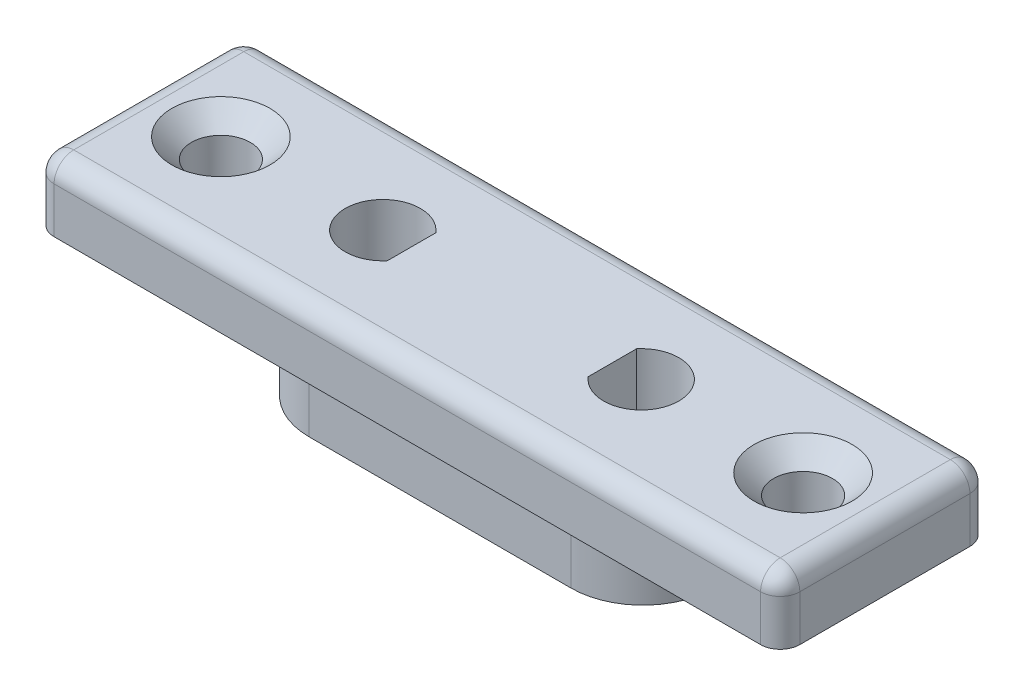
ISO-10303-21;
HEADER;
FILE_DESCRIPTION(('STEP AP214'),'2;1');
FILE_NAME('part.step','',(''),(''),'','','');
FILE_SCHEMA(('AUTOMOTIVE_DESIGN { 1 0 10303 214 1 1 1 1 }'));
ENDSEC;
DATA;
#1=APPLICATION_CONTEXT('core data for automotive mechanical design processes');
#2=APPLICATION_PROTOCOL_DEFINITION('international standard','automotive_design',2000,#1);
#3=PRODUCT_CONTEXT('',#1,'mechanical');
#4=PRODUCT('Part','Part','',(#3));
#5=PRODUCT_RELATED_PRODUCT_CATEGORY('part','',(#4));
#6=PRODUCT_DEFINITION_FORMATION('','',#4);
#7=PRODUCT_DEFINITION_CONTEXT('part definition',#1,'design');
#8=PRODUCT_DEFINITION('design','',#6,#7);
#9=PRODUCT_DEFINITION_SHAPE('','',#8);
#10=(LENGTH_UNIT() NAMED_UNIT(*) SI_UNIT(.MILLI.,.METRE.));
#11=(NAMED_UNIT(*) PLANE_ANGLE_UNIT() SI_UNIT($,.RADIAN.));
#12=(NAMED_UNIT(*) SI_UNIT($,.STERADIAN.) SOLID_ANGLE_UNIT());
#13=UNCERTAINTY_MEASURE_WITH_UNIT(LENGTH_MEASURE(1.E-05),#10,'distance_accuracy_value','');
#14=(GEOMETRIC_REPRESENTATION_CONTEXT(3) GLOBAL_UNCERTAINTY_ASSIGNED_CONTEXT((#13)) GLOBAL_UNIT_ASSIGNED_CONTEXT((#10,
#11,#12)) REPRESENTATION_CONTEXT('',''));
#15=CARTESIAN_POINT('',(0.,0.,0.));
#16=DIRECTION('',(0.,0.,1.));
#17=DIRECTION('',(1.,0.,0.));
#18=AXIS2_PLACEMENT_3D('',#15,#16,#17);
#19=CARTESIAN_POINT('',(18.5,-6.,-8.));
#20=DIRECTION('',(0.,-1.,0.));
#21=DIRECTION('',(0.,0.,-1.));
#22=AXIS2_PLACEMENT_3D('',#19,#20,#21);
#23=PLANE('',#22);
#24=DIRECTION('',(0.,0.,1.));
#25=VECTOR('',#24,1.);
#26=CARTESIAN_POINT('',(20.825,-6.,-9.85084440188795));
#27=LINE('',#26,#25);
#28=CARTESIAN_POINT('',(20.825,-6.,-9.85084440188795));
#29=VERTEX_POINT('',#28);
#30=CARTESIAN_POINT('',(20.825,-6.,-6.14915559811204));
#31=VERTEX_POINT('',#30);
#32=EDGE_CURVE('E174',#29,#31,#27,.T.);
#33=ORIENTED_EDGE('',*,*,#32,.F.);
#34=CARTESIAN_POINT('',(18.625,-6.,-8.));
#35=DIRECTION('',(0.,-1.,0.));
#36=DIRECTION('',(0.,0.,-1.));
#37=AXIS2_PLACEMENT_3D('',#34,#35,#36);
#38=CIRCLE('',#37,2.875);
#39=EDGE_CURVE('E164',#31,#29,#38,.T.);
#40=ORIENTED_EDGE('',*,*,#39,.F.);
#41=EDGE_LOOP('',(#33,#40));
#42=FACE_BOUND('',#41,.T.);
#43=DIRECTION('',(0.,0.,-1.));
#44=VECTOR('',#43,1.);
#45=CARTESIAN_POINT('',(36.175,-6.,-6.14915559811205));
#46=LINE('',#45,#44);
#47=CARTESIAN_POINT('',(36.175,-6.,-6.14915559811205));
#48=VERTEX_POINT('',#47);
#49=CARTESIAN_POINT('',(36.175,-6.,-9.85084440188795));
#50=VERTEX_POINT('',#49);
#51=EDGE_CURVE('E189',#48,#50,#46,.T.);
#52=ORIENTED_EDGE('',*,*,#51,.F.);
#53=CARTESIAN_POINT('',(38.375,-6.,-8.));
#54=DIRECTION('',(0.,-1.,0.));
#55=DIRECTION('',(0.,0.,-1.));
#56=AXIS2_PLACEMENT_3D('',#53,#54,#55);
#57=CIRCLE('',#56,2.875);
#58=EDGE_CURVE('E177',#50,#48,#57,.T.);
#59=ORIENTED_EDGE('',*,*,#58,.F.);
#60=EDGE_LOOP('',(#52,#59));
#61=FACE_BOUND('',#60,.T.);
#62=CARTESIAN_POINT('',(18.5,-6.,-8.));
#63=DIRECTION('',(0.,-1.,0.));
#64=DIRECTION('',(0.,0.,-1.));
#65=AXIS2_PLACEMENT_3D('',#62,#63,#64);
#66=CIRCLE('',#65,5.5);
#67=CARTESIAN_POINT('',(18.5,-6.,-2.5));
#68=VERTEX_POINT('',#67);
#69=CARTESIAN_POINT('',(18.5,-6.,-13.5));
#70=VERTEX_POINT('',#69);
#71=EDGE_CURVE('E193',#68,#70,#66,.T.);
#72=ORIENTED_EDGE('',*,*,#71,.T.);
#73=DIRECTION('',(1.,0.,0.));
#74=VECTOR('',#73,1.);
#75=CARTESIAN_POINT('',(18.5,-6.,-13.5));
#76=LINE('',#75,#74);
#77=CARTESIAN_POINT('',(38.5,-6.,-13.5));
#78=VERTEX_POINT('',#77);
#79=EDGE_CURVE('E196',#70,#78,#76,.T.);
#80=ORIENTED_EDGE('',*,*,#79,.T.);
#81=CARTESIAN_POINT('',(38.5,-6.,-8.));
#82=DIRECTION('',(0.,-1.,0.));
#83=DIRECTION('',(0.,0.,-1.));
#84=AXIS2_PLACEMENT_3D('',#81,#82,#83);
#85=CIRCLE('',#84,5.5);
#86=CARTESIAN_POINT('',(38.5,-6.,-2.5));
#87=VERTEX_POINT('',#86);
#88=EDGE_CURVE('E199',#78,#87,#85,.T.);
#89=ORIENTED_EDGE('',*,*,#88,.T.);
#90=DIRECTION('',(-1.,0.,0.));
#91=VECTOR('',#90,1.);
#92=CARTESIAN_POINT('',(38.5,-6.,-2.5));
#93=LINE('',#92,#91);
#94=EDGE_CURVE('E201',#87,#68,#93,.T.);
#95=ORIENTED_EDGE('',*,*,#94,.T.);
#96=EDGE_LOOP('',(#72,#80,#89,#95));
#97=FACE_BOUND('',#96,.T.);
#98=CARTESIAN_POINT('',(28.5,-6.,-8.));
#99=DIRECTION('',(0.,-1.,0.));
#100=DIRECTION('',(0.,0.,-1.));
#101=AXIS2_PLACEMENT_3D('',#98,#99,#100);
#102=CIRCLE('',#101,4.);
#103=CARTESIAN_POINT('',(28.5,-6.,-12.));
#104=VERTEX_POINT('',#103);
#105=EDGE_CURVE('E407',#104,#104,#102,.T.);
#106=ORIENTED_EDGE('',*,*,#105,.F.);
#107=EDGE_LOOP('',(#106));
#108=FACE_BOUND('',#107,.T.);
#109=ADVANCED_FACE('F34',(#42,#61,#97,#108),#23,.T.);
#110=CARTESIAN_POINT('',(0.,0.,0.));
#111=DIRECTION('',(0.,-1.,0.));
#112=DIRECTION('',(0.,0.,-1.));
#113=AXIS2_PLACEMENT_3D('',#110,#111,#112);
#114=PLANE('',#113);
#115=DIRECTION('',(1.,0.,0.));
#116=VECTOR('',#115,1.);
#117=CARTESIAN_POINT('',(57.,0.,0.));
#118=LINE('',#117,#116);
#119=CARTESIAN_POINT('',(1.50000000000002,0.,0.));
#120=VERTEX_POINT('',#119);
#121=CARTESIAN_POINT('',(55.5,0.,0.));
#122=VERTEX_POINT('',#121);
#123=EDGE_CURVE('E237',#120,#122,#118,.T.);
#124=ORIENTED_EDGE('',*,*,#123,.F.);
#125=CARTESIAN_POINT('',(1.5,0.,-1.5));
#126=DIRECTION('',(0.,-1.,0.));
#127=DIRECTION('',(0.,0.,-1.));
#128=AXIS2_PLACEMENT_3D('',#125,#126,#127);
#129=CIRCLE('',#128,1.5);
#130=CARTESIAN_POINT('',(0.,0.,-1.5));
#131=VERTEX_POINT('',#130);
#132=EDGE_CURVE('E290',#120,#131,#129,.T.);
#133=ORIENTED_EDGE('',*,*,#132,.T.);
#134=DIRECTION('',(0.,0.,1.));
#135=VECTOR('',#134,1.);
#136=CARTESIAN_POINT('',(0.,0.,0.));
#137=LINE('',#136,#135);
#138=CARTESIAN_POINT('',(0.,0.,-14.5));
#139=VERTEX_POINT('',#138);
#140=EDGE_CURVE('E247',#139,#131,#137,.T.);
#141=ORIENTED_EDGE('',*,*,#140,.F.);
#142=CARTESIAN_POINT('',(1.5,0.,-14.5));
#143=DIRECTION('',(0.,-1.,0.));
#144=DIRECTION('',(0.,0.,-1.));
#145=AXIS2_PLACEMENT_3D('',#142,#143,#144);
#146=CIRCLE('',#145,1.5);
#147=CARTESIAN_POINT('',(1.5,0.,-16.));
#148=VERTEX_POINT('',#147);
#149=EDGE_CURVE('E288',#139,#148,#146,.T.);
#150=ORIENTED_EDGE('',*,*,#149,.T.);
#151=DIRECTION('',(-1.,0.,0.));
#152=VECTOR('',#151,1.);
#153=CARTESIAN_POINT('',(0.,0.,-16.));
#154=LINE('',#153,#152);
#155=CARTESIAN_POINT('',(55.5,0.,-16.));
#156=VERTEX_POINT('',#155);
#157=EDGE_CURVE('E244',#156,#148,#154,.T.);
#158=ORIENTED_EDGE('',*,*,#157,.F.);
#159=CARTESIAN_POINT('',(55.5,0.,-14.5));
#160=DIRECTION('',(0.,-1.,0.));
#161=DIRECTION('',(0.,0.,-1.));
#162=AXIS2_PLACEMENT_3D('',#159,#160,#161);
#163=CIRCLE('',#162,1.5);
#164=CARTESIAN_POINT('',(57.,0.,-14.5));
#165=VERTEX_POINT('',#164);
#166=EDGE_CURVE('E286',#156,#165,#163,.T.);
#167=ORIENTED_EDGE('',*,*,#166,.T.);
#168=DIRECTION('',(0.,0.,-1.));
#169=VECTOR('',#168,1.);
#170=CARTESIAN_POINT('',(57.,0.,-16.));
#171=LINE('',#170,#169);
#172=CARTESIAN_POINT('',(57.,0.,-1.5));
#173=VERTEX_POINT('',#172);
#174=EDGE_CURVE('E240',#173,#165,#171,.T.);
#175=ORIENTED_EDGE('',*,*,#174,.F.);
#176=CARTESIAN_POINT('',(55.5,0.,-1.5));
#177=DIRECTION('',(0.,-1.,0.));
#178=DIRECTION('',(0.,0.,-1.));
#179=AXIS2_PLACEMENT_3D('',#176,#177,#178);
#180=CIRCLE('',#179,1.5);
#181=EDGE_CURVE('E284',#173,#122,#180,.T.);
#182=ORIENTED_EDGE('',*,*,#181,.T.);
#183=EDGE_LOOP('',(#124,#133,#141,#150,#158,#167,#175,#182));
#184=FACE_BOUND('',#183,.T.);
#185=CARTESIAN_POINT('',(50.75,0.,-8.00000000000001));
#186=DIRECTION('',(0.,1.,0.));
#187=DIRECTION('',(0.,0.,1.));
#188=AXIS2_PLACEMENT_3D('',#185,#186,#187);
#189=CIRCLE('',#188,2.25);
#190=CARTESIAN_POINT('',(50.75,0.,-5.75000000000001));
#191=VERTEX_POINT('',#190);
#192=EDGE_CURVE('E222',#191,#191,#189,.T.);
#193=ORIENTED_EDGE('',*,*,#192,.T.);
#194=EDGE_LOOP('',(#193));
#195=FACE_BOUND('',#194,.T.);
#196=CARTESIAN_POINT('',(6.25,0.,-8.));
#197=DIRECTION('',(0.,1.,0.));
#198=DIRECTION('',(0.,0.,1.));
#199=AXIS2_PLACEMENT_3D('',#196,#197,#198);
#200=CIRCLE('',#199,2.25);
#201=CARTESIAN_POINT('',(6.25,0.,-5.75));
#202=VERTEX_POINT('',#201);
#203=EDGE_CURVE('E219',#202,#202,#200,.T.);
#204=ORIENTED_EDGE('',*,*,#203,.T.);
#205=EDGE_LOOP('',(#204));
#206=FACE_BOUND('',#205,.T.);
#207=DIRECTION('',(1.,0.,0.));
#208=VECTOR('',#207,1.);
#209=CARTESIAN_POINT('',(18.5,0.,-13.5));
#210=LINE('',#209,#208);
#211=CARTESIAN_POINT('',(18.5,0.,-13.5));
#212=VERTEX_POINT('',#211);
#213=CARTESIAN_POINT('',(38.5,0.,-13.5));
#214=VERTEX_POINT('',#213);
#215=EDGE_CURVE('E206',#212,#214,#210,.T.);
#216=ORIENTED_EDGE('',*,*,#215,.F.);
#217=CARTESIAN_POINT('',(18.5,0.,-8.));
#218=DIRECTION('',(0.,-1.,0.));
#219=DIRECTION('',(0.,0.,-1.));
#220=AXIS2_PLACEMENT_3D('',#217,#218,#219);
#221=CIRCLE('',#220,5.5);
#222=CARTESIAN_POINT('',(18.5,0.,-2.5));
#223=VERTEX_POINT('',#222);
#224=EDGE_CURVE('E192',#223,#212,#221,.T.);
#225=ORIENTED_EDGE('',*,*,#224,.F.);
#226=DIRECTION('',(-1.,0.,0.));
#227=VECTOR('',#226,1.);
#228=CARTESIAN_POINT('',(38.5,0.,-2.5));
#229=LINE('',#228,#227);
#230=CARTESIAN_POINT('',(38.5,0.,-2.5));
#231=VERTEX_POINT('',#230);
#232=EDGE_CURVE('E197',#231,#223,#229,.T.);
#233=ORIENTED_EDGE('',*,*,#232,.F.);
#234=CARTESIAN_POINT('',(38.5,0.,-8.));
#235=DIRECTION('',(0.,-1.,0.));
#236=DIRECTION('',(0.,0.,-1.));
#237=AXIS2_PLACEMENT_3D('',#234,#235,#236);
#238=CIRCLE('',#237,5.5);
#239=EDGE_CURVE('E208',#214,#231,#238,.T.);
#240=ORIENTED_EDGE('',*,*,#239,.F.);
#241=EDGE_LOOP('',(#216,#225,#233,#240));
#242=FACE_BOUND('',#241,.T.);
#243=ADVANCED_FACE('F348',(#184,#195,#206,#242),#114,.T.);
#244=CARTESIAN_POINT('',(57.,5.,0.));
#245=DIRECTION('',(0.,0.,-1.));
#246=DIRECTION('',(-1.,0.,0.));
#247=AXIS2_PLACEMENT_3D('',#244,#245,#246);
#248=PLANE('',#247);
#249=DIRECTION('',(1.,0.,0.));
#250=VECTOR('',#249,1.);
#251=CARTESIAN_POINT('',(57.,3.5,0.));
#252=LINE('',#251,#250);
#253=CARTESIAN_POINT('',(55.5,3.5,0.));
#254=VERTEX_POINT('',#253);
#255=CARTESIAN_POINT('',(1.5,3.5,0.));
#256=VERTEX_POINT('',#255);
#257=EDGE_CURVE('E280',#254,#256,#252,.F.);
#258=ORIENTED_EDGE('',*,*,#257,.T.);
#259=DIRECTION('',(0.,-1.,0.));
#260=VECTOR('',#259,1.);
#261=CARTESIAN_POINT('',(1.5,5.,0.));
#262=LINE('',#261,#260);
#263=EDGE_CURVE('E282',#256,#120,#262,.T.);
#264=ORIENTED_EDGE('',*,*,#263,.T.);
#265=ORIENTED_EDGE('',*,*,#123,.T.);
#266=DIRECTION('',(0.,-1.,0.));
#267=VECTOR('',#266,1.);
#268=CARTESIAN_POINT('',(55.5,5.,0.));
#269=LINE('',#268,#267);
#270=EDGE_CURVE('E278',#122,#254,#269,.F.);
#271=ORIENTED_EDGE('',*,*,#270,.T.);
#272=EDGE_LOOP('',(#258,#264,#265,#271));
#273=FACE_BOUND('',#272,.T.);
#274=ADVANCED_FACE('F351',(#273),#248,.F.);
#275=CARTESIAN_POINT('',(57.,5.,-16.));
#276=DIRECTION('',(-1.,0.,0.));
#277=DIRECTION('',(0.,0.,1.));
#278=AXIS2_PLACEMENT_3D('',#275,#276,#277);
#279=PLANE('',#278);
#280=ORIENTED_EDGE('',*,*,#174,.T.);
#281=DIRECTION('',(0.,-1.,0.));
#282=VECTOR('',#281,1.);
#283=CARTESIAN_POINT('',(57.,5.,-14.5));
#284=LINE('',#283,#282);
#285=CARTESIAN_POINT('',(57.,3.5,-14.5));
#286=VERTEX_POINT('',#285);
#287=EDGE_CURVE('E276',#165,#286,#284,.F.);
#288=ORIENTED_EDGE('',*,*,#287,.T.);
#289=DIRECTION('',(0.,0.,-1.));
#290=VECTOR('',#289,1.);
#291=CARTESIAN_POINT('',(57.,3.5,-16.));
#292=LINE('',#291,#290);
#293=CARTESIAN_POINT('',(57.,3.5,-1.5));
#294=VERTEX_POINT('',#293);
#295=EDGE_CURVE('E274',#286,#294,#292,.F.);
#296=ORIENTED_EDGE('',*,*,#295,.T.);
#297=DIRECTION('',(0.,-1.,0.));
#298=VECTOR('',#297,1.);
#299=CARTESIAN_POINT('',(57.,5.,-1.5));
#300=LINE('',#299,#298);
#301=EDGE_CURVE('E272',#294,#173,#300,.T.);
#302=ORIENTED_EDGE('',*,*,#301,.T.);
#303=EDGE_LOOP('',(#280,#288,#296,#302));
#304=FACE_BOUND('',#303,.T.);
#305=ADVANCED_FACE('F684',(#304),#279,.F.);
#306=CARTESIAN_POINT('',(0.,5.,-16.));
#307=DIRECTION('',(0.,0.,1.));
#308=DIRECTION('',(1.,0.,0.));
#309=AXIS2_PLACEMENT_3D('',#306,#307,#308);
#310=PLANE('',#309);
#311=ORIENTED_EDGE('',*,*,#157,.T.);
#312=DIRECTION('',(0.,-1.,0.));
#313=VECTOR('',#312,1.);
#314=CARTESIAN_POINT('',(1.5,5.,-16.));
#315=LINE('',#314,#313);
#316=CARTESIAN_POINT('',(1.5,3.5,-16.));
#317=VERTEX_POINT('',#316);
#318=EDGE_CURVE('E270',#148,#317,#315,.F.);
#319=ORIENTED_EDGE('',*,*,#318,.T.);
#320=DIRECTION('',(-1.,0.,0.));
#321=VECTOR('',#320,1.);
#322=CARTESIAN_POINT('',(0.,3.5,-16.));
#323=LINE('',#322,#321);
#324=CARTESIAN_POINT('',(55.5,3.5,-16.));
#325=VERTEX_POINT('',#324);
#326=EDGE_CURVE('E268',#317,#325,#323,.F.);
#327=ORIENTED_EDGE('',*,*,#326,.T.);
#328=DIRECTION('',(0.,-1.,0.));
#329=VECTOR('',#328,1.);
#330=CARTESIAN_POINT('',(55.5,5.,-16.));
#331=LINE('',#330,#329);
#332=EDGE_CURVE('E266',#325,#156,#331,.T.);
#333=ORIENTED_EDGE('',*,*,#332,.T.);
#334=EDGE_LOOP('',(#311,#319,#327,#333));
#335=FACE_BOUND('',#334,.T.);
#336=ADVANCED_FACE('F674',(#335),#310,.F.);
#337=CARTESIAN_POINT('',(0.,5.,0.));
#338=DIRECTION('',(1.,0.,0.));
#339=DIRECTION('',(0.,0.,-1.));
#340=AXIS2_PLACEMENT_3D('',#337,#338,#339);
#341=PLANE('',#340);
#342=ORIENTED_EDGE('',*,*,#140,.T.);
#343=DIRECTION('',(0.,-1.,0.));
#344=VECTOR('',#343,1.);
#345=CARTESIAN_POINT('',(0.,5.,-1.5));
#346=LINE('',#345,#344);
#347=CARTESIAN_POINT('',(0.,3.5,-1.5));
#348=VERTEX_POINT('',#347);
#349=EDGE_CURVE('E264',#131,#348,#346,.F.);
#350=ORIENTED_EDGE('',*,*,#349,.T.);
#351=DIRECTION('',(0.,0.,1.));
#352=VECTOR('',#351,1.);
#353=CARTESIAN_POINT('',(0.,3.5,0.));
#354=LINE('',#353,#352);
#355=CARTESIAN_POINT('',(0.,3.5,-14.5));
#356=VERTEX_POINT('',#355);
#357=EDGE_CURVE('E261',#348,#356,#354,.F.);
#358=ORIENTED_EDGE('',*,*,#357,.T.);
#359=DIRECTION('',(0.,-1.,0.));
#360=VECTOR('',#359,1.);
#361=CARTESIAN_POINT('',(0.,5.,-14.5));
#362=LINE('',#361,#360);
#363=EDGE_CURVE('E259',#356,#139,#362,.T.);
#364=ORIENTED_EDGE('',*,*,#363,.T.);
#365=EDGE_LOOP('',(#342,#350,#358,#364));
#366=FACE_BOUND('',#365,.T.);
#367=ADVANCED_FACE('F548',(#366),#341,.F.);
#368=CARTESIAN_POINT('',(0.,5.,0.));
#369=DIRECTION('',(0.,-1.,0.));
#370=DIRECTION('',(0.,0.,-1.));
#371=AXIS2_PLACEMENT_3D('',#368,#369,#370);
#372=PLANE('',#371);
#373=CARTESIAN_POINT('',(50.75,5.,-8.00000000000001));
#374=DIRECTION('',(0.,-1.,0.));
#375=DIRECTION('',(0.,0.,-1.));
#376=AXIS2_PLACEMENT_3D('',#373,#374,#375);
#377=CIRCLE('',#376,3.75);
#378=CARTESIAN_POINT('',(50.75,5.,-11.75));
#379=VERTEX_POINT('',#378);
#380=EDGE_CURVE('E42',#379,#379,#377,.T.);
#381=ORIENTED_EDGE('',*,*,#380,.T.);
#382=EDGE_LOOP('',(#381));
#383=FACE_BOUND('',#382,.T.);
#384=CARTESIAN_POINT('',(6.25,5.,-8.));
#385=DIRECTION('',(0.,-1.,0.));
#386=DIRECTION('',(0.,0.,-1.));
#387=AXIS2_PLACEMENT_3D('',#384,#385,#386);
#388=CIRCLE('',#387,3.75);
#389=CARTESIAN_POINT('',(6.25,5.,-11.75));
#390=VERTEX_POINT('',#389);
#391=EDGE_CURVE('E327',#390,#390,#388,.T.);
#392=ORIENTED_EDGE('',*,*,#391,.T.);
#393=EDGE_LOOP('',(#392));
#394=FACE_BOUND('',#393,.T.);
#395=DIRECTION('',(0.,0.,1.));
#396=VECTOR('',#395,1.);
#397=CARTESIAN_POINT('',(36.175,5.,-9.85084440188795));
#398=LINE('',#397,#396);
#399=CARTESIAN_POINT('',(36.175,5.,-9.85084440188795));
#400=VERTEX_POINT('',#399);
#401=CARTESIAN_POINT('',(36.175,5.,-6.14915559811205));
#402=VERTEX_POINT('',#401);
#403=EDGE_CURVE('E226',#400,#402,#398,.T.);
#404=ORIENTED_EDGE('',*,*,#403,.F.);
#405=CARTESIAN_POINT('',(38.375,5.,-8.));
#406=DIRECTION('',(0.,1.,0.));
#407=DIRECTION('',(0.,0.,1.));
#408=AXIS2_PLACEMENT_3D('',#405,#406,#407);
#409=CIRCLE('',#408,2.875);
#410=EDGE_CURVE('E57',#402,#400,#409,.T.);
#411=ORIENTED_EDGE('',*,*,#410,.F.);
#412=EDGE_LOOP('',(#404,#411));
#413=FACE_BOUND('',#412,.T.);
#414=DIRECTION('',(0.,0.,-1.));
#415=VECTOR('',#414,1.);
#416=CARTESIAN_POINT('',(20.825,5.,-9.85084440188795));
#417=LINE('',#416,#415);
#418=CARTESIAN_POINT('',(20.825,5.,-6.14915559811204));
#419=VERTEX_POINT('',#418);
#420=CARTESIAN_POINT('',(20.825,5.,-9.85084440188795));
#421=VERTEX_POINT('',#420);
#422=EDGE_CURVE('E172',#419,#421,#417,.T.);
#423=ORIENTED_EDGE('',*,*,#422,.F.);
#424=CARTESIAN_POINT('',(18.625,5.,-8.));
#425=DIRECTION('',(0.,1.,0.));
#426=DIRECTION('',(0.,0.,1.));
#427=AXIS2_PLACEMENT_3D('',#424,#425,#426);
#428=CIRCLE('',#427,2.875);
#429=EDGE_CURVE('E167',#421,#419,#428,.T.);
#430=ORIENTED_EDGE('',*,*,#429,.F.);
#431=EDGE_LOOP('',(#423,#430));
#432=FACE_BOUND('',#431,.T.);
#433=DIRECTION('',(-1.,0.,0.));
#434=VECTOR('',#433,1.);
#435=CARTESIAN_POINT('',(0.,5.,-14.5));
#436=LINE('',#435,#434);
#437=CARTESIAN_POINT('',(55.5,5.,-14.5));
#438=VERTEX_POINT('',#437);
#439=CARTESIAN_POINT('',(1.5,5.,-14.5));
#440=VERTEX_POINT('',#439);
#441=EDGE_CURVE('E254',#438,#440,#436,.T.);
#442=ORIENTED_EDGE('',*,*,#441,.T.);
#443=DIRECTION('',(0.,0.,1.));
#444=VECTOR('',#443,1.);
#445=CARTESIAN_POINT('',(1.5,5.,0.));
#446=LINE('',#445,#444);
#447=CARTESIAN_POINT('',(1.5,5.,-1.5));
#448=VERTEX_POINT('',#447);
#449=EDGE_CURVE('E256',#440,#448,#446,.T.);
#450=ORIENTED_EDGE('',*,*,#449,.T.);
#451=DIRECTION('',(1.,0.,0.));
#452=VECTOR('',#451,1.);
#453=CARTESIAN_POINT('',(0.,5.,-1.5));
#454=LINE('',#453,#452);
#455=CARTESIAN_POINT('',(55.5,5.,-1.5));
#456=VERTEX_POINT('',#455);
#457=EDGE_CURVE('E250',#448,#456,#454,.T.);
#458=ORIENTED_EDGE('',*,*,#457,.T.);
#459=DIRECTION('',(0.,0.,-1.));
#460=VECTOR('',#459,1.);
#461=CARTESIAN_POINT('',(55.5,5.,0.));
#462=LINE('',#461,#460);
#463=EDGE_CURVE('E252',#456,#438,#462,.T.);
#464=ORIENTED_EDGE('',*,*,#463,.T.);
#465=EDGE_LOOP('',(#442,#450,#458,#464));
#466=FACE_BOUND('',#465,.T.);
#467=ADVANCED_FACE('F332',(#383,#394,#413,#432,#466),#372,.F.);
#468=CARTESIAN_POINT('',(55.5,5.,-14.5));
#469=DIRECTION('',(0.,-1.,0.));
#470=DIRECTION('',(0.,0.,-1.));
#471=AXIS2_PLACEMENT_3D('',#468,#469,#470);
#472=CYLINDRICAL_SURFACE('',#471,1.5);
#473=ORIENTED_EDGE('',*,*,#166,.F.);
#474=ORIENTED_EDGE('',*,*,#332,.F.);
#475=CARTESIAN_POINT('',(55.5,3.5,-14.5));
#476=DIRECTION('',(0.,1.,0.));
#477=DIRECTION('',(0.,0.,1.));
#478=AXIS2_PLACEMENT_3D('',#475,#476,#477);
#479=CIRCLE('',#478,1.5);
#480=EDGE_CURVE('E241',#286,#325,#479,.T.);
#481=ORIENTED_EDGE('',*,*,#480,.F.);
#482=ORIENTED_EDGE('',*,*,#287,.F.);
#483=EDGE_LOOP('',(#473,#474,#481,#482));
#484=FACE_BOUND('',#483,.T.);
#485=ADVANCED_FACE('F547',(#484),#472,.T.);
#486=CARTESIAN_POINT('',(55.5,3.5,0.));
#487=DIRECTION('',(0.,0.,-1.));
#488=DIRECTION('',(-1.,0.,0.));
#489=AXIS2_PLACEMENT_3D('',#486,#487,#488);
#490=CYLINDRICAL_SURFACE('',#489,1.5);
#491=CARTESIAN_POINT('',(55.5,3.5,-1.5));
#492=DIRECTION('',(0.,0.,1.));
#493=DIRECTION('',(0.,-1.,0.));
#494=AXIS2_PLACEMENT_3D('',#491,#492,#493);
#495=CIRCLE('',#494,1.5);
#496=EDGE_CURVE('E317',#294,#456,#495,.T.);
#497=ORIENTED_EDGE('',*,*,#496,.F.);
#498=ORIENTED_EDGE('',*,*,#295,.F.);
#499=CARTESIAN_POINT('',(55.5,3.5,-14.5));
#500=DIRECTION('',(0.,0.,-1.));
#501=DIRECTION('',(-1.,0.,0.));
#502=AXIS2_PLACEMENT_3D('',#499,#500,#501);
#503=CIRCLE('',#502,1.5);
#504=EDGE_CURVE('E320',#438,#286,#503,.T.);
#505=ORIENTED_EDGE('',*,*,#504,.F.);
#506=ORIENTED_EDGE('',*,*,#463,.F.);
#507=EDGE_LOOP('',(#497,#498,#505,#506));
#508=FACE_BOUND('',#507,.T.);
#509=ADVANCED_FACE('F650',(#508),#490,.T.);
#510=CARTESIAN_POINT('',(55.5,5.,-1.5));
#511=DIRECTION('',(0.,-1.,0.));
#512=DIRECTION('',(0.,0.,-1.));
#513=AXIS2_PLACEMENT_3D('',#510,#511,#512);
#514=CYLINDRICAL_SURFACE('',#513,1.5);
#515=ORIENTED_EDGE('',*,*,#181,.F.);
#516=ORIENTED_EDGE('',*,*,#301,.F.);
#517=CARTESIAN_POINT('',(55.5,3.5,-1.5));
#518=DIRECTION('',(0.,1.,0.));
#519=DIRECTION('',(0.,0.,1.));
#520=AXIS2_PLACEMENT_3D('',#517,#518,#519);
#521=CIRCLE('',#520,1.5);
#522=EDGE_CURVE('E314',#254,#294,#521,.T.);
#523=ORIENTED_EDGE('',*,*,#522,.F.);
#524=ORIENTED_EDGE('',*,*,#270,.F.);
#525=EDGE_LOOP('',(#515,#516,#523,#524));
#526=FACE_BOUND('',#525,.T.);
#527=ADVANCED_FACE('F640',(#526),#514,.T.);
#528=CARTESIAN_POINT('',(55.5,3.5,-14.5));
#529=DIRECTION('',(0.,0.,1.));
#530=DIRECTION('',(1.,0.,0.));
#531=AXIS2_PLACEMENT_3D('',#528,#529,#530);
#532=SPHERICAL_SURFACE('',#531,1.5);
#533=ORIENTED_EDGE('',*,*,#504,.T.);
#534=ORIENTED_EDGE('',*,*,#480,.T.);
#535=CARTESIAN_POINT('',(55.5,3.5,-14.5));
#536=DIRECTION('',(1.,0.,0.));
#537=DIRECTION('',(0.,0.,-1.));
#538=AXIS2_PLACEMENT_3D('',#535,#536,#537);
#539=CIRCLE('',#538,1.5);
#540=EDGE_CURVE('E311',#438,#325,#539,.F.);
#541=ORIENTED_EDGE('',*,*,#540,.F.);
#542=EDGE_LOOP('',(#533,#534,#541));
#543=FACE_BOUND('',#542,.T.);
#544=ADVANCED_FACE('F630',(#543),#532,.T.);
#545=CARTESIAN_POINT('',(55.5,3.5,-1.5));
#546=DIRECTION('',(0.,0.,1.));
#547=DIRECTION('',(1.,0.,0.));
#548=AXIS2_PLACEMENT_3D('',#545,#546,#547);
#549=SPHERICAL_SURFACE('',#548,1.5);
#550=ORIENTED_EDGE('',*,*,#522,.T.);
#551=ORIENTED_EDGE('',*,*,#496,.T.);
#552=CARTESIAN_POINT('',(55.5,3.5,-1.5));
#553=DIRECTION('',(1.,0.,0.));
#554=DIRECTION('',(0.,0.,-1.));
#555=AXIS2_PLACEMENT_3D('',#552,#553,#554);
#556=CIRCLE('',#555,1.5);
#557=EDGE_CURVE('E308',#254,#456,#556,.F.);
#558=ORIENTED_EDGE('',*,*,#557,.F.);
#559=EDGE_LOOP('',(#550,#551,#558));
#560=FACE_BOUND('',#559,.T.);
#561=ADVANCED_FACE('F620',(#560),#549,.T.);
#562=CARTESIAN_POINT('',(1.5,5.,-14.5));
#563=DIRECTION('',(0.,-1.,0.));
#564=DIRECTION('',(0.,0.,-1.));
#565=AXIS2_PLACEMENT_3D('',#562,#563,#564);
#566=CYLINDRICAL_SURFACE('',#565,1.5);
#567=ORIENTED_EDGE('',*,*,#149,.F.);
#568=ORIENTED_EDGE('',*,*,#363,.F.);
#569=CARTESIAN_POINT('',(1.5,3.5,-14.5));
#570=DIRECTION('',(0.,1.,0.));
#571=DIRECTION('',(0.,0.,1.));
#572=AXIS2_PLACEMENT_3D('',#569,#570,#571);
#573=CIRCLE('',#572,1.5);
#574=EDGE_CURVE('E305',#317,#356,#573,.T.);
#575=ORIENTED_EDGE('',*,*,#574,.F.);
#576=ORIENTED_EDGE('',*,*,#318,.F.);
#577=EDGE_LOOP('',(#567,#568,#575,#576));
#578=FACE_BOUND('',#577,.T.);
#579=ADVANCED_FACE('F610',(#578),#566,.T.);
#580=CARTESIAN_POINT('',(0.,3.5,-14.5));
#581=DIRECTION('',(-1.,0.,0.));
#582=DIRECTION('',(0.,0.,1.));
#583=AXIS2_PLACEMENT_3D('',#580,#581,#582);
#584=CYLINDRICAL_SURFACE('',#583,1.5);
#585=ORIENTED_EDGE('',*,*,#540,.T.);
#586=ORIENTED_EDGE('',*,*,#326,.F.);
#587=CARTESIAN_POINT('',(1.5,3.5,-14.5));
#588=DIRECTION('',(-1.,0.,0.));
#589=DIRECTION('',(0.,0.,1.));
#590=AXIS2_PLACEMENT_3D('',#587,#588,#589);
#591=CIRCLE('',#590,1.5);
#592=EDGE_CURVE('E302',#440,#317,#591,.T.);
#593=ORIENTED_EDGE('',*,*,#592,.F.);
#594=ORIENTED_EDGE('',*,*,#441,.F.);
#595=EDGE_LOOP('',(#585,#586,#593,#594));
#596=FACE_BOUND('',#595,.T.);
#597=ADVANCED_FACE('F600',(#596),#584,.T.);
#598=CARTESIAN_POINT('',(0.,3.5,-1.5));
#599=DIRECTION('',(1.,0.,0.));
#600=DIRECTION('',(0.,0.,-1.));
#601=AXIS2_PLACEMENT_3D('',#598,#599,#600);
#602=CYLINDRICAL_SURFACE('',#601,1.5);
#603=ORIENTED_EDGE('',*,*,#557,.T.);
#604=ORIENTED_EDGE('',*,*,#457,.F.);
#605=CARTESIAN_POINT('',(1.5,3.5,-1.5));
#606=DIRECTION('',(-1.,0.,0.));
#607=DIRECTION('',(0.,-1.,0.));
#608=AXIS2_PLACEMENT_3D('',#605,#606,#607);
#609=CIRCLE('',#608,1.5);
#610=EDGE_CURVE('E299',#256,#448,#609,.T.);
#611=ORIENTED_EDGE('',*,*,#610,.F.);
#612=ORIENTED_EDGE('',*,*,#257,.F.);
#613=EDGE_LOOP('',(#603,#604,#611,#612));
#614=FACE_BOUND('',#613,.T.);
#615=ADVANCED_FACE('F590',(#614),#602,.T.);
#616=CARTESIAN_POINT('',(1.5,5.,-1.5));
#617=DIRECTION('',(0.,-1.,0.));
#618=DIRECTION('',(0.,0.,-1.));
#619=AXIS2_PLACEMENT_3D('',#616,#617,#618);
#620=CYLINDRICAL_SURFACE('',#619,1.5);
#621=ORIENTED_EDGE('',*,*,#132,.F.);
#622=ORIENTED_EDGE('',*,*,#263,.F.);
#623=CARTESIAN_POINT('',(1.5,3.5,-1.5));
#624=DIRECTION('',(0.,1.,0.));
#625=DIRECTION('',(0.,0.,1.));
#626=AXIS2_PLACEMENT_3D('',#623,#624,#625);
#627=CIRCLE('',#626,1.5);
#628=EDGE_CURVE('E296',#348,#256,#627,.T.);
#629=ORIENTED_EDGE('',*,*,#628,.F.);
#630=ORIENTED_EDGE('',*,*,#349,.F.);
#631=EDGE_LOOP('',(#621,#622,#629,#630));
#632=FACE_BOUND('',#631,.T.);
#633=ADVANCED_FACE('F580',(#632),#620,.T.);
#634=CARTESIAN_POINT('',(1.5,3.5,-14.5));
#635=DIRECTION('',(0.,0.,1.));
#636=DIRECTION('',(1.,0.,0.));
#637=AXIS2_PLACEMENT_3D('',#634,#635,#636);
#638=SPHERICAL_SURFACE('',#637,1.5);
#639=ORIENTED_EDGE('',*,*,#592,.T.);
#640=ORIENTED_EDGE('',*,*,#574,.T.);
#641=CARTESIAN_POINT('',(1.5,3.5,-14.5));
#642=DIRECTION('',(0.,0.,-1.));
#643=DIRECTION('',(-1.,0.,0.));
#644=AXIS2_PLACEMENT_3D('',#641,#642,#643);
#645=CIRCLE('',#644,1.5);
#646=EDGE_CURVE('E294',#440,#356,#645,.F.);
#647=ORIENTED_EDGE('',*,*,#646,.F.);
#648=EDGE_LOOP('',(#639,#640,#647));
#649=FACE_BOUND('',#648,.T.);
#650=ADVANCED_FACE('F570',(#649),#638,.T.);
#651=CARTESIAN_POINT('',(1.5,3.5,-1.5));
#652=DIRECTION('',(0.,0.,1.));
#653=DIRECTION('',(1.,0.,0.));
#654=AXIS2_PLACEMENT_3D('',#651,#652,#653);
#655=SPHERICAL_SURFACE('',#654,1.5);
#656=ORIENTED_EDGE('',*,*,#628,.T.);
#657=ORIENTED_EDGE('',*,*,#610,.T.);
#658=CARTESIAN_POINT('',(1.5,3.5,-1.5));
#659=DIRECTION('',(0.,0.,1.));
#660=DIRECTION('',(1.,0.,0.));
#661=AXIS2_PLACEMENT_3D('',#658,#659,#660);
#662=CIRCLE('',#661,1.5);
#663=EDGE_CURVE('E232',#348,#448,#662,.F.);
#664=ORIENTED_EDGE('',*,*,#663,.F.);
#665=EDGE_LOOP('',(#656,#657,#664));
#666=FACE_BOUND('',#665,.T.);
#667=ADVANCED_FACE('F560',(#666),#655,.T.);
#668=CARTESIAN_POINT('',(1.5,3.5,0.));
#669=DIRECTION('',(0.,0.,1.));
#670=DIRECTION('',(1.,0.,0.));
#671=AXIS2_PLACEMENT_3D('',#668,#669,#670);
#672=CYLINDRICAL_SURFACE('',#671,1.5);
#673=ORIENTED_EDGE('',*,*,#646,.T.);
#674=ORIENTED_EDGE('',*,*,#357,.F.);
#675=ORIENTED_EDGE('',*,*,#663,.T.);
#676=ORIENTED_EDGE('',*,*,#449,.F.);
#677=EDGE_LOOP('',(#673,#674,#675,#676));
#678=FACE_BOUND('',#677,.T.);
#679=ADVANCED_FACE('F507',(#678),#672,.T.);
#680=CARTESIAN_POINT('',(18.625,-10.,-8.));
#681=DIRECTION('',(0.,1.,0.));
#682=DIRECTION('',(0.,0.,1.));
#683=AXIS2_PLACEMENT_3D('',#680,#681,#682);
#684=CYLINDRICAL_SURFACE('',#683,2.875);
#685=DIRECTION('',(0.,1.,0.));
#686=VECTOR('',#685,1.);
#687=CARTESIAN_POINT('',(20.825,-10.,-6.14915559811204));
#688=LINE('',#687,#686);
#689=EDGE_CURVE('E160',#31,#419,#688,.T.);
#690=ORIENTED_EDGE('',*,*,#689,.F.);
#691=ORIENTED_EDGE('',*,*,#39,.T.);
#692=DIRECTION('',(0.,1.,0.));
#693=VECTOR('',#692,1.);
#694=CARTESIAN_POINT('',(20.825,-10.,-9.85084440188795));
#695=LINE('',#694,#693);
#696=EDGE_CURVE('E171',#29,#421,#695,.T.);
#697=ORIENTED_EDGE('',*,*,#696,.T.);
#698=ORIENTED_EDGE('',*,*,#429,.T.);
#699=EDGE_LOOP('',(#690,#691,#697,#698));
#700=FACE_BOUND('',#699,.T.);
#701=ADVANCED_FACE('F162',(#700),#684,.F.);
#702=CARTESIAN_POINT('',(20.825,-10.,-9.85084440188795));
#703=DIRECTION('',(1.,0.,0.));
#704=DIRECTION('',(0.,0.,-1.));
#705=AXIS2_PLACEMENT_3D('',#702,#703,#704);
#706=PLANE('',#705);
#707=ORIENTED_EDGE('',*,*,#696,.F.);
#708=ORIENTED_EDGE('',*,*,#32,.T.);
#709=ORIENTED_EDGE('',*,*,#689,.T.);
#710=ORIENTED_EDGE('',*,*,#422,.T.);
#711=EDGE_LOOP('',(#707,#708,#709,#710));
#712=FACE_BOUND('',#711,.T.);
#713=ADVANCED_FACE('F175',(#712),#706,.F.);
#714=CARTESIAN_POINT('',(38.375,-10.,-8.));
#715=DIRECTION('',(0.,1.,0.));
#716=DIRECTION('',(0.,0.,1.));
#717=AXIS2_PLACEMENT_3D('',#714,#715,#716);
#718=CYLINDRICAL_SURFACE('',#717,2.875);
#719=DIRECTION('',(0.,1.,0.));
#720=VECTOR('',#719,1.);
#721=CARTESIAN_POINT('',(36.175,-10.,-9.85084440188795));
#722=LINE('',#721,#720);
#723=EDGE_CURVE('E229',#50,#400,#722,.T.);
#724=ORIENTED_EDGE('',*,*,#723,.F.);
#725=ORIENTED_EDGE('',*,*,#58,.T.);
#726=DIRECTION('',(0.,1.,0.));
#727=VECTOR('',#726,1.);
#728=CARTESIAN_POINT('',(36.175,-10.,-6.14915559811205));
#729=LINE('',#728,#727);
#730=EDGE_CURVE('E230',#48,#402,#729,.T.);
#731=ORIENTED_EDGE('',*,*,#730,.T.);
#732=ORIENTED_EDGE('',*,*,#410,.T.);
#733=EDGE_LOOP('',(#724,#725,#731,#732));
#734=FACE_BOUND('',#733,.T.);
#735=ADVANCED_FACE('F474',(#734),#718,.F.);
#736=CARTESIAN_POINT('',(36.175,-10.,-9.85084440188795));
#737=DIRECTION('',(-1.,0.,0.));
#738=DIRECTION('',(0.,0.,1.));
#739=AXIS2_PLACEMENT_3D('',#736,#737,#738);
#740=PLANE('',#739);
#741=ORIENTED_EDGE('',*,*,#730,.F.);
#742=ORIENTED_EDGE('',*,*,#51,.T.);
#743=ORIENTED_EDGE('',*,*,#723,.T.);
#744=ORIENTED_EDGE('',*,*,#403,.T.);
#745=EDGE_LOOP('',(#741,#742,#743,#744));
#746=FACE_BOUND('',#745,.T.);
#747=ADVANCED_FACE('F344',(#746),#740,.F.);
#748=CARTESIAN_POINT('',(50.75,5.,-8.00000000000001));
#749=DIRECTION('',(0.,1.,0.));
#750=DIRECTION('',(0.,0.,1.));
#751=AXIS2_PLACEMENT_3D('',#748,#749,#750);
#752=CYLINDRICAL_SURFACE('',#751,2.25);
#753=CARTESIAN_POINT('',(50.75,3.5,-8.00000000000001));
#754=DIRECTION('',(0.,-1.,0.));
#755=DIRECTION('',(0.,0.,-1.));
#756=AXIS2_PLACEMENT_3D('',#753,#754,#755);
#757=CIRCLE('',#756,2.25);
#758=CARTESIAN_POINT('',(50.75,3.5,-10.25));
#759=VERTEX_POINT('',#758);
#760=EDGE_CURVE('E292',#759,#759,#757,.F.);
#761=ORIENTED_EDGE('',*,*,#760,.T.);
#762=EDGE_LOOP('',(#761));
#763=FACE_BOUND('',#762,.T.);
#764=ORIENTED_EDGE('',*,*,#192,.F.);
#765=EDGE_LOOP('',(#764));
#766=FACE_BOUND('',#765,.T.);
#767=ADVANCED_FACE('F341',(#763,#766),#752,.F.);
#768=CARTESIAN_POINT('',(6.25,5.,-8.));
#769=DIRECTION('',(0.,1.,0.));
#770=DIRECTION('',(0.,0.,1.));
#771=AXIS2_PLACEMENT_3D('',#768,#769,#770);
#772=CYLINDRICAL_SURFACE('',#771,2.25);
#773=CARTESIAN_POINT('',(6.25,3.5,-8.));
#774=DIRECTION('',(0.,-1.,0.));
#775=DIRECTION('',(0.,0.,-1.));
#776=AXIS2_PLACEMENT_3D('',#773,#774,#775);
#777=CIRCLE('',#776,2.25);
#778=CARTESIAN_POINT('',(6.25,3.5,-10.25));
#779=VERTEX_POINT('',#778);
#780=EDGE_CURVE('E11',#779,#779,#777,.F.);
#781=ORIENTED_EDGE('',*,*,#780,.T.);
#782=EDGE_LOOP('',(#781));
#783=FACE_BOUND('',#782,.T.);
#784=ORIENTED_EDGE('',*,*,#203,.F.);
#785=EDGE_LOOP('',(#784));
#786=FACE_BOUND('',#785,.T.);
#787=ADVANCED_FACE('F338',(#783,#786),#772,.F.);
#788=CARTESIAN_POINT('',(50.75,3.5,-8.00000000000001));
#789=DIRECTION('',(0.,1.,0.));
#790=DIRECTION('',(0.,0.,1.));
#791=AXIS2_PLACEMENT_3D('',#788,#789,#790);
#792=CONICAL_SURFACE('',#791,2.25,0.785398163397448);
#793=ORIENTED_EDGE('',*,*,#380,.F.);
#794=EDGE_LOOP('',(#793));
#795=FACE_BOUND('',#794,.T.);
#796=ORIENTED_EDGE('',*,*,#760,.F.);
#797=EDGE_LOOP('',(#796));
#798=FACE_BOUND('',#797,.T.);
#799=ADVANCED_FACE('F335',(#795,#798),#792,.F.);
#800=CARTESIAN_POINT('',(6.25,3.5,-8.));
#801=DIRECTION('',(0.,1.,0.));
#802=DIRECTION('',(0.,0.,1.));
#803=AXIS2_PLACEMENT_3D('',#800,#801,#802);
#804=CONICAL_SURFACE('',#803,2.25,0.785398163397448);
#805=ORIENTED_EDGE('',*,*,#391,.F.);
#806=EDGE_LOOP('',(#805));
#807=FACE_BOUND('',#806,.T.);
#808=ORIENTED_EDGE('',*,*,#780,.F.);
#809=EDGE_LOOP('',(#808));
#810=FACE_BOUND('',#809,.T.);
#811=ADVANCED_FACE('F36',(#807,#810),#804,.F.);
#812=CARTESIAN_POINT('',(18.5,-6.,-8.));
#813=DIRECTION('',(0.,1.,0.));
#814=DIRECTION('',(0.,0.,1.));
#815=AXIS2_PLACEMENT_3D('',#812,#813,#814);
#816=CYLINDRICAL_SURFACE('',#815,5.5);
#817=ORIENTED_EDGE('',*,*,#224,.T.);
#818=DIRECTION('',(0.,1.,0.));
#819=VECTOR('',#818,1.);
#820=CARTESIAN_POINT('',(18.5,-6.,-13.5));
#821=LINE('',#820,#819);
#822=EDGE_CURVE('E217',#70,#212,#821,.T.);
#823=ORIENTED_EDGE('',*,*,#822,.F.);
#824=ORIENTED_EDGE('',*,*,#71,.F.);
#825=DIRECTION('',(0.,1.,0.));
#826=VECTOR('',#825,1.);
#827=CARTESIAN_POINT('',(18.5,-6.,-2.5));
#828=LINE('',#827,#826);
#829=EDGE_CURVE('E203',#68,#223,#828,.T.);
#830=ORIENTED_EDGE('',*,*,#829,.T.);
#831=EDGE_LOOP('',(#817,#823,#824,#830));
#832=FACE_BOUND('',#831,.T.);
#833=ADVANCED_FACE('F372',(#832),#816,.T.);
#834=CARTESIAN_POINT('',(18.5,-6.,-13.5));
#835=DIRECTION('',(0.,0.,1.));
#836=DIRECTION('',(1.,0.,0.));
#837=AXIS2_PLACEMENT_3D('',#834,#835,#836);
#838=PLANE('',#837);
#839=ORIENTED_EDGE('',*,*,#215,.T.);
#840=DIRECTION('',(0.,1.,0.));
#841=VECTOR('',#840,1.);
#842=CARTESIAN_POINT('',(38.5,-6.,-13.5));
#843=LINE('',#842,#841);
#844=EDGE_CURVE('E214',#78,#214,#843,.T.);
#845=ORIENTED_EDGE('',*,*,#844,.F.);
#846=ORIENTED_EDGE('',*,*,#79,.F.);
#847=ORIENTED_EDGE('',*,*,#822,.T.);
#848=EDGE_LOOP('',(#839,#845,#846,#847));
#849=FACE_BOUND('',#848,.T.);
#850=ADVANCED_FACE('F362',(#849),#838,.F.);
#851=CARTESIAN_POINT('',(38.5,-6.,-8.));
#852=DIRECTION('',(0.,1.,0.));
#853=DIRECTION('',(0.,0.,1.));
#854=AXIS2_PLACEMENT_3D('',#851,#852,#853);
#855=CYLINDRICAL_SURFACE('',#854,5.5);
#856=ORIENTED_EDGE('',*,*,#239,.T.);
#857=DIRECTION('',(0.,1.,0.));
#858=VECTOR('',#857,1.);
#859=CARTESIAN_POINT('',(38.5,-6.,-2.5));
#860=LINE('',#859,#858);
#861=EDGE_CURVE('E49',#87,#231,#860,.T.);
#862=ORIENTED_EDGE('',*,*,#861,.F.);
#863=ORIENTED_EDGE('',*,*,#88,.F.);
#864=ORIENTED_EDGE('',*,*,#844,.T.);
#865=EDGE_LOOP('',(#856,#862,#863,#864));
#866=FACE_BOUND('',#865,.T.);
#867=ADVANCED_FACE('F366',(#866),#855,.T.);
#868=CARTESIAN_POINT('',(38.5,-6.,-2.5));
#869=DIRECTION('',(0.,0.,-1.));
#870=DIRECTION('',(-1.,0.,0.));
#871=AXIS2_PLACEMENT_3D('',#868,#869,#870);
#872=PLANE('',#871);
#873=ORIENTED_EDGE('',*,*,#232,.T.);
#874=ORIENTED_EDGE('',*,*,#829,.F.);
#875=ORIENTED_EDGE('',*,*,#94,.F.);
#876=ORIENTED_EDGE('',*,*,#861,.T.);
#877=EDGE_LOOP('',(#873,#874,#875,#876));
#878=FACE_BOUND('',#877,.T.);
#879=ADVANCED_FACE('F373',(#878),#872,.F.);
#880=CARTESIAN_POINT('',(28.5,-6.1,-8.));
#881=DIRECTION('',(0.,-1.,0.));
#882=DIRECTION('',(0.,0.,-1.));
#883=AXIS2_PLACEMENT_3D('',#880,#881,#882);
#884=PLANE('',#883);
#885=CARTESIAN_POINT('',(28.5,-6.1,-8.));
#886=DIRECTION('',(0.,-1.,0.));
#887=DIRECTION('',(0.,0.,-1.));
#888=AXIS2_PLACEMENT_3D('',#885,#886,#887);
#889=CIRCLE('',#888,4.);
#890=CARTESIAN_POINT('',(28.5,-6.1,-12.));
#891=VERTEX_POINT('',#890);
#892=EDGE_CURVE('E183',#891,#891,#889,.T.);
#893=ORIENTED_EDGE('',*,*,#892,.T.);
#894=EDGE_LOOP('',(#893));
#895=FACE_BOUND('',#894,.T.);
#896=CARTESIAN_POINT('',(28.5,-6.1,-8.));
#897=DIRECTION('',(0.,-1.,0.));
#898=DIRECTION('',(0.,0.,-1.));
#899=AXIS2_PLACEMENT_3D('',#896,#897,#898);
#900=CIRCLE('',#899,2.25);
#901=CARTESIAN_POINT('',(28.5,-6.1,-10.25));
#902=VERTEX_POINT('',#901);
#903=EDGE_CURVE('E408',#902,#902,#900,.T.);
#904=ORIENTED_EDGE('',*,*,#903,.F.);
#905=EDGE_LOOP('',(#904));
#906=FACE_BOUND('',#905,.T.);
#907=ADVANCED_FACE('F375',(#895,#906),#884,.T.);
#908=CARTESIAN_POINT('',(28.5,-6.1,-8.));
#909=DIRECTION('',(0.,1.,0.));
#910=DIRECTION('',(0.,0.,1.));
#911=AXIS2_PLACEMENT_3D('',#908,#909,#910);
#912=CYLINDRICAL_SURFACE('',#911,4.);
#913=ORIENTED_EDGE('',*,*,#892,.F.);
#914=EDGE_LOOP('',(#913));
#915=FACE_BOUND('',#914,.T.);
#916=ORIENTED_EDGE('',*,*,#105,.T.);
#917=EDGE_LOOP('',(#916));
#918=FACE_BOUND('',#917,.T.);
#919=ADVANCED_FACE('F381',(#915,#918),#912,.T.);
#920=CARTESIAN_POINT('',(28.5,3.25,-8.));
#921=DIRECTION('',(0.,-1.,0.));
#922=DIRECTION('',(0.,0.,-1.));
#923=AXIS2_PLACEMENT_3D('',#920,#921,#922);
#924=PLANE('',#923);
#925=CARTESIAN_POINT('',(28.5,3.25,-8.));
#926=DIRECTION('',(0.,-1.,0.));
#927=DIRECTION('',(0.,0.,-1.));
#928=AXIS2_PLACEMENT_3D('',#925,#926,#927);
#929=CIRCLE('',#928,2.25);
#930=CARTESIAN_POINT('',(28.5,3.25,-10.25));
#931=VERTEX_POINT('',#930);
#932=EDGE_CURVE('E180',#931,#931,#929,.T.);
#933=ORIENTED_EDGE('',*,*,#932,.T.);
#934=EDGE_LOOP('',(#933));
#935=FACE_BOUND('',#934,.T.);
#936=ADVANCED_FACE('F393',(#935),#924,.T.);
#937=CARTESIAN_POINT('',(28.5,3.25,-8.));
#938=DIRECTION('',(0.,-1.,0.));
#939=DIRECTION('',(0.,0.,-1.));
#940=AXIS2_PLACEMENT_3D('',#937,#938,#939);
#941=CYLINDRICAL_SURFACE('',#940,2.25);
#942=ORIENTED_EDGE('',*,*,#932,.F.);
#943=EDGE_LOOP('',(#942));
#944=FACE_BOUND('',#943,.T.);
#945=ORIENTED_EDGE('',*,*,#903,.T.);
#946=EDGE_LOOP('',(#945));
#947=FACE_BOUND('',#946,.T.);
#948=ADVANCED_FACE('F390',(#944,#947),#941,.F.);
#949=CLOSED_SHELL('',(#109,#243,#274,#305,#336,#367,#467,#485,#509,#527,#544,#561,#579,#597,
#615,#633,#650,#667,#679,#701,#713,#735,#747,#767,#787,#799,#811,#833,#850,#867,#879,#907,#919,
#936,#948));
#950=MANIFOLD_SOLID_BREP('B2',#949);
#951=ADVANCED_BREP_SHAPE_REPRESENTATION('',(#18,#950),#14);
#952=SHAPE_DEFINITION_REPRESENTATION(#9,#951);
ENDSEC;
END-ISO-10303-21;
